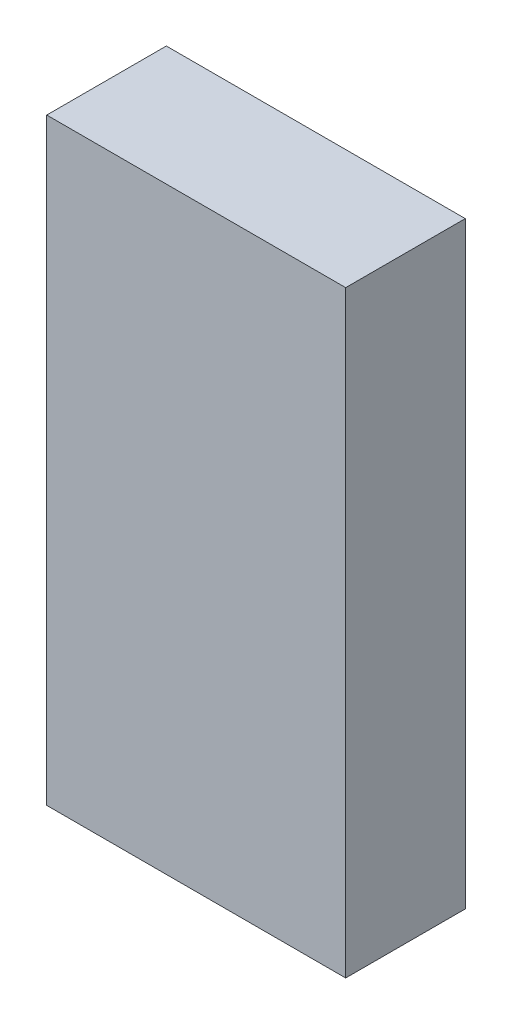
ISO-10303-21;
HEADER;
FILE_DESCRIPTION(('STEP AP214'),'2;1');
FILE_NAME('part.step','',(''),(''),'','','');
FILE_SCHEMA(('AUTOMOTIVE_DESIGN { 1 0 10303 214 1 1 1 1 }'));
ENDSEC;
DATA;
#1=APPLICATION_CONTEXT('core data for automotive mechanical design processes');
#2=APPLICATION_PROTOCOL_DEFINITION('international standard','automotive_design',2000,#1);
#3=PRODUCT_CONTEXT('',#1,'mechanical');
#4=PRODUCT('Part','Part','',(#3));
#5=PRODUCT_RELATED_PRODUCT_CATEGORY('part','',(#4));
#6=PRODUCT_DEFINITION_FORMATION('','',#4);
#7=PRODUCT_DEFINITION_CONTEXT('part definition',#1,'design');
#8=PRODUCT_DEFINITION('design','',#6,#7);
#9=PRODUCT_DEFINITION_SHAPE('','',#8);
#10=(LENGTH_UNIT() NAMED_UNIT(*) SI_UNIT(.MILLI.,.METRE.));
#11=(NAMED_UNIT(*) PLANE_ANGLE_UNIT() SI_UNIT($,.RADIAN.));
#12=(NAMED_UNIT(*) SI_UNIT($,.STERADIAN.) SOLID_ANGLE_UNIT());
#13=UNCERTAINTY_MEASURE_WITH_UNIT(LENGTH_MEASURE(1.E-05),#10,'distance_accuracy_value','');
#14=(GEOMETRIC_REPRESENTATION_CONTEXT(3) GLOBAL_UNCERTAINTY_ASSIGNED_CONTEXT((#13)) GLOBAL_UNIT_ASSIGNED_CONTEXT((#10,
#11,#12)) REPRESENTATION_CONTEXT('',''));
#15=CARTESIAN_POINT('',(0.,0.,0.));
#16=DIRECTION('',(0.,0.,1.));
#17=DIRECTION('',(1.,0.,0.));
#18=AXIS2_PLACEMENT_3D('',#15,#16,#17);
#19=CARTESIAN_POINT('',(25.,100.,9.99999999999999));
#20=DIRECTION('',(-1.,0.,0.));
#21=DIRECTION('',(0.,0.,1.));
#22=AXIS2_PLACEMENT_3D('',#19,#20,#21);
#23=PLANE('',#22);
#24=DIRECTION('',(0.,0.,-1.));
#25=VECTOR('',#24,1.);
#26=CARTESIAN_POINT('',(25.,0.,9.99999999999999));
#27=LINE('',#26,#25);
#28=CARTESIAN_POINT('',(25.,0.,9.99999999999999));
#29=VERTEX_POINT('',#28);
#30=CARTESIAN_POINT('',(25.,0.,-10.));
#31=VERTEX_POINT('',#30);
#32=EDGE_CURVE('E98',#29,#31,#27,.T.);
#33=ORIENTED_EDGE('',*,*,#32,.T.);
#34=DIRECTION('',(0.,-1.,0.));
#35=VECTOR('',#34,1.);
#36=CARTESIAN_POINT('',(25.,100.,-10.));
#37=LINE('',#36,#35);
#38=CARTESIAN_POINT('',(25.,100.,-10.));
#39=VERTEX_POINT('',#38);
#40=EDGE_CURVE('E11',#39,#31,#37,.T.);
#41=ORIENTED_EDGE('',*,*,#40,.F.);
#42=DIRECTION('',(0.,0.,-1.));
#43=VECTOR('',#42,1.);
#44=CARTESIAN_POINT('',(25.,100.,9.99999999999999));
#45=LINE('',#44,#43);
#46=CARTESIAN_POINT('',(25.,100.,9.99999999999999));
#47=VERTEX_POINT('',#46);
#48=EDGE_CURVE('E86',#47,#39,#45,.T.);
#49=ORIENTED_EDGE('',*,*,#48,.F.);
#50=DIRECTION('',(0.,-1.,0.));
#51=VECTOR('',#50,1.);
#52=CARTESIAN_POINT('',(25.,100.,9.99999999999999));
#53=LINE('',#52,#51);
#54=EDGE_CURVE('E94',#47,#29,#53,.T.);
#55=ORIENTED_EDGE('',*,*,#54,.T.);
#56=EDGE_LOOP('',(#33,#41,#49,#55));
#57=FACE_BOUND('',#56,.T.);
#58=ADVANCED_FACE('F35',(#57),#23,.F.);
#59=CARTESIAN_POINT('',(-25.,100.,-10.));
#60=DIRECTION('',(0.,0.,1.));
#61=DIRECTION('',(1.,0.,0.));
#62=AXIS2_PLACEMENT_3D('',#59,#60,#61);
#63=PLANE('',#62);
#64=DIRECTION('',(-1.,0.,0.));
#65=VECTOR('',#64,1.);
#66=CARTESIAN_POINT('',(-25.,0.,-10.));
#67=LINE('',#66,#65);
#68=CARTESIAN_POINT('',(-25.,0.,-10.));
#69=VERTEX_POINT('',#68);
#70=EDGE_CURVE('E90',#31,#69,#67,.T.);
#71=ORIENTED_EDGE('',*,*,#70,.T.);
#72=DIRECTION('',(0.,-1.,0.));
#73=VECTOR('',#72,1.);
#74=CARTESIAN_POINT('',(-25.,100.,-10.));
#75=LINE('',#74,#73);
#76=CARTESIAN_POINT('',(-25.,100.,-10.));
#77=VERTEX_POINT('',#76);
#78=EDGE_CURVE('E43',#77,#69,#75,.T.);
#79=ORIENTED_EDGE('',*,*,#78,.F.);
#80=DIRECTION('',(-1.,0.,0.));
#81=VECTOR('',#80,1.);
#82=CARTESIAN_POINT('',(-25.,100.,-10.));
#83=LINE('',#82,#81);
#84=EDGE_CURVE('E81',#39,#77,#83,.T.);
#85=ORIENTED_EDGE('',*,*,#84,.F.);
#86=ORIENTED_EDGE('',*,*,#40,.T.);
#87=EDGE_LOOP('',(#71,#79,#85,#86));
#88=FACE_BOUND('',#87,.T.);
#89=ADVANCED_FACE('F89',(#88),#63,.F.);
#90=CARTESIAN_POINT('',(-25.,100.,9.99999999999998));
#91=DIRECTION('',(1.,0.,0.));
#92=DIRECTION('',(0.,0.,-1.));
#93=AXIS2_PLACEMENT_3D('',#90,#91,#92);
#94=PLANE('',#93);
#95=DIRECTION('',(0.,0.,1.));
#96=VECTOR('',#95,1.);
#97=CARTESIAN_POINT('',(-25.,0.,9.99999999999998));
#98=LINE('',#97,#96);
#99=CARTESIAN_POINT('',(-25.,0.,9.99999999999998));
#100=VERTEX_POINT('',#99);
#101=EDGE_CURVE('E68',#69,#100,#98,.T.);
#102=ORIENTED_EDGE('',*,*,#101,.T.);
#103=DIRECTION('',(0.,-1.,0.));
#104=VECTOR('',#103,1.);
#105=CARTESIAN_POINT('',(-25.,100.,9.99999999999998));
#106=LINE('',#105,#104);
#107=CARTESIAN_POINT('',(-25.,100.,9.99999999999998));
#108=VERTEX_POINT('',#107);
#109=EDGE_CURVE('E91',#108,#100,#106,.T.);
#110=ORIENTED_EDGE('',*,*,#109,.F.);
#111=DIRECTION('',(0.,0.,1.));
#112=VECTOR('',#111,1.);
#113=CARTESIAN_POINT('',(-25.,100.,9.99999999999998));
#114=LINE('',#113,#112);
#115=EDGE_CURVE('E84',#77,#108,#114,.T.);
#116=ORIENTED_EDGE('',*,*,#115,.F.);
#117=ORIENTED_EDGE('',*,*,#78,.T.);
#118=EDGE_LOOP('',(#102,#110,#116,#117));
#119=FACE_BOUND('',#118,.T.);
#120=ADVANCED_FACE('F92',(#119),#94,.F.);
#121=CARTESIAN_POINT('',(-25.,100.,9.99999999999998));
#122=DIRECTION('',(0.,0.,-1.));
#123=DIRECTION('',(-1.,0.,0.));
#124=AXIS2_PLACEMENT_3D('',#121,#122,#123);
#125=PLANE('',#124);
#126=DIRECTION('',(1.,0.,0.));
#127=VECTOR('',#126,1.);
#128=CARTESIAN_POINT('',(-25.,0.,9.99999999999998));
#129=LINE('',#128,#127);
#130=EDGE_CURVE('E74',#100,#29,#129,.T.);
#131=ORIENTED_EDGE('',*,*,#130,.T.);
#132=ORIENTED_EDGE('',*,*,#54,.F.);
#133=DIRECTION('',(1.,0.,0.));
#134=VECTOR('',#133,1.);
#135=CARTESIAN_POINT('',(-25.,100.,9.99999999999998));
#136=LINE('',#135,#134);
#137=EDGE_CURVE('E51',#108,#47,#136,.T.);
#138=ORIENTED_EDGE('',*,*,#137,.F.);
#139=ORIENTED_EDGE('',*,*,#109,.T.);
#140=EDGE_LOOP('',(#131,#132,#138,#139));
#141=FACE_BOUND('',#140,.T.);
#142=ADVANCED_FACE('F105',(#141),#125,.F.);
#143=CARTESIAN_POINT('',(0.,100.,0.));
#144=DIRECTION('',(0.,-1.,0.));
#145=DIRECTION('',(0.,0.,-1.));
#146=AXIS2_PLACEMENT_3D('',#143,#144,#145);
#147=PLANE('',#146);
#148=ORIENTED_EDGE('',*,*,#48,.T.);
#149=ORIENTED_EDGE('',*,*,#84,.T.);
#150=ORIENTED_EDGE('',*,*,#115,.T.);
#151=ORIENTED_EDGE('',*,*,#137,.T.);
#152=EDGE_LOOP('',(#148,#149,#150,#151));
#153=FACE_BOUND('',#152,.T.);
#154=ADVANCED_FACE('F82',(#153),#147,.F.);
#155=CARTESIAN_POINT('',(0.,0.,0.));
#156=DIRECTION('',(0.,-1.,0.));
#157=DIRECTION('',(0.,0.,-1.));
#158=AXIS2_PLACEMENT_3D('',#155,#156,#157);
#159=PLANE('',#158);
#160=ORIENTED_EDGE('',*,*,#32,.F.);
#161=ORIENTED_EDGE('',*,*,#130,.F.);
#162=ORIENTED_EDGE('',*,*,#101,.F.);
#163=ORIENTED_EDGE('',*,*,#70,.F.);
#164=EDGE_LOOP('',(#160,#161,#162,#163));
#165=FACE_BOUND('',#164,.T.);
#166=ADVANCED_FACE('F108',(#165),#159,.T.);
#167=CLOSED_SHELL('',(#58,#89,#120,#142,#154,#166));
#168=MANIFOLD_SOLID_BREP('B2',#167);
#169=ADVANCED_BREP_SHAPE_REPRESENTATION('',(#18,#168),#14);
#170=SHAPE_DEFINITION_REPRESENTATION(#9,#169);
ENDSEC;
END-ISO-10303-21;
